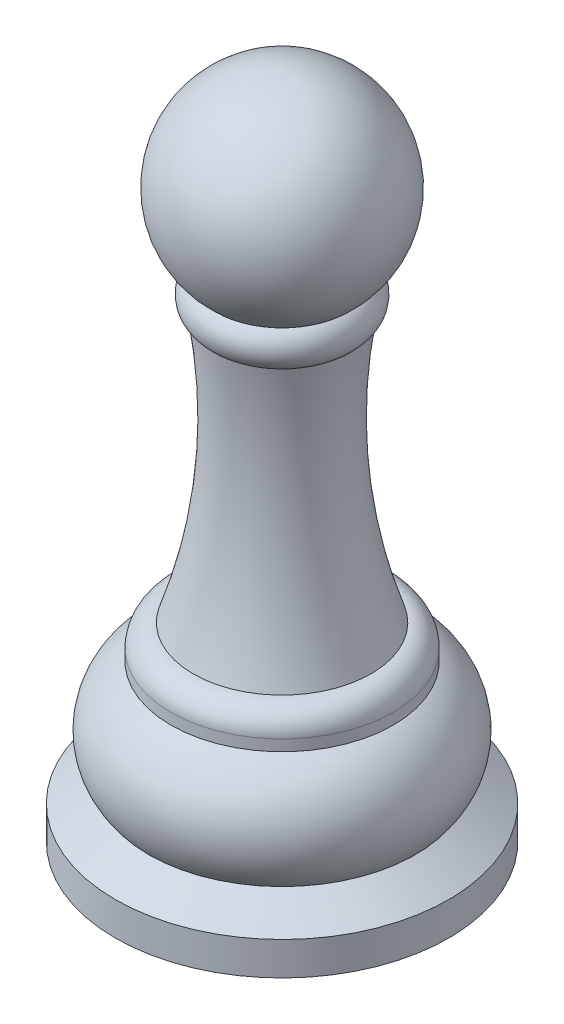
ISO-10303-21;
HEADER;
FILE_DESCRIPTION(('STEP AP214'),'2;1');
FILE_NAME('part.step','',(''),(''),'','','');
FILE_SCHEMA(('AUTOMOTIVE_DESIGN { 1 0 10303 214 1 1 1 1 }'));
ENDSEC;
DATA;
#1=APPLICATION_CONTEXT('core data for automotive mechanical design processes');
#2=APPLICATION_PROTOCOL_DEFINITION('international standard','automotive_design',2000,#1);
#3=PRODUCT_CONTEXT('',#1,'mechanical');
#4=PRODUCT('Part','Part','',(#3));
#5=PRODUCT_RELATED_PRODUCT_CATEGORY('part','',(#4));
#6=PRODUCT_DEFINITION_FORMATION('','',#4);
#7=PRODUCT_DEFINITION_CONTEXT('part definition',#1,'design');
#8=PRODUCT_DEFINITION('design','',#6,#7);
#9=PRODUCT_DEFINITION_SHAPE('','',#8);
#10=(LENGTH_UNIT() NAMED_UNIT(*) SI_UNIT(.MILLI.,.METRE.));
#11=(NAMED_UNIT(*) PLANE_ANGLE_UNIT() SI_UNIT($,.RADIAN.));
#12=(NAMED_UNIT(*) SI_UNIT($,.STERADIAN.) SOLID_ANGLE_UNIT());
#13=UNCERTAINTY_MEASURE_WITH_UNIT(LENGTH_MEASURE(1.E-05),#10,'distance_accuracy_value','');
#14=(GEOMETRIC_REPRESENTATION_CONTEXT(3) GLOBAL_UNCERTAINTY_ASSIGNED_CONTEXT((#13)) GLOBAL_UNIT_ASSIGNED_CONTEXT((#10,
#11,#12)) REPRESENTATION_CONTEXT('',''));
#15=CARTESIAN_POINT('',(0.,0.,0.));
#16=DIRECTION('',(0.,0.,1.));
#17=DIRECTION('',(1.,0.,0.));
#18=AXIS2_PLACEMENT_3D('',#15,#16,#17);
#19=CARTESIAN_POINT('',(0.,-17.3082039324994,0.));
#20=DIRECTION('',(0.,1.,0.));
#21=DIRECTION('',(0.,0.,1.));
#22=AXIS2_PLACEMENT_3D('',#19,#20,#21);
#23=TOROIDAL_SURFACE('',#22,4.8,2.);
#24=CARTESIAN_POINT('',(0.,-18.9082039324994,0.));
#25=DIRECTION('',(0.,1.,0.));
#26=DIRECTION('',(0.,0.,1.));
#27=AXIS2_PLACEMENT_3D('',#24,#25,#26);
#28=CIRCLE('',#27,5.99999999999999);
#29=CARTESIAN_POINT('',(0.,-18.9082039324994,5.99999999999999));
#30=VERTEX_POINT('',#29);
#31=EDGE_CURVE('E10',#30,#30,#28,.T.);
#32=ORIENTED_EDGE('',*,*,#31,.T.);
#33=EDGE_LOOP('',(#32));
#34=FACE_BOUND('',#33,.T.);
#35=CARTESIAN_POINT('',(0.,-15.7082039324994,0.));
#36=DIRECTION('',(0.,1.,0.));
#37=DIRECTION('',(0.,0.,1.));
#38=AXIS2_PLACEMENT_3D('',#35,#36,#37);
#39=CIRCLE('',#38,6.);
#40=CARTESIAN_POINT('',(0.,-15.7082039324994,6.));
#41=VERTEX_POINT('',#40);
#42=EDGE_CURVE('E72',#41,#41,#39,.T.);
#43=ORIENTED_EDGE('',*,*,#42,.F.);
#44=EDGE_LOOP('',(#43));
#45=FACE_BOUND('',#44,.T.);
#46=ADVANCED_FACE('F37',(#34,#45),#23,.T.);
#47=CARTESIAN_POINT('',(0.,-26.8781444651534,0.));
#48=DIRECTION('',(0.,1.,0.));
#49=DIRECTION('',(0.,0.,1.));
#50=AXIS2_PLACEMENT_3D('',#47,#48,#49);
#51=TOROIDAL_SURFACE('',#50,55.3607136081516,50.);
#52=CARTESIAN_POINT('',(0.,-42.9082039324994,0.));
#53=DIRECTION('',(0.,1.,0.));
#54=DIRECTION('',(0.,0.,1.));
#55=AXIS2_PLACEMENT_3D('',#52,#53,#54);
#56=CIRCLE('',#55,7.99999999999998);
#57=CARTESIAN_POINT('',(0.,-42.9082039324994,7.99999999999998));
#58=VERTEX_POINT('',#57);
#59=EDGE_CURVE('E44',#58,#58,#56,.T.);
#60=ORIENTED_EDGE('',*,*,#59,.T.);
#61=EDGE_LOOP('',(#60));
#62=FACE_BOUND('',#61,.T.);
#63=ORIENTED_EDGE('',*,*,#31,.F.);
#64=EDGE_LOOP('',(#63));
#65=FACE_BOUND('',#64,.T.);
#66=ADVANCED_FACE('F80',(#62,#65),#51,.F.);
#67=CARTESIAN_POINT('',(0.,-44.9082039324994,0.));
#68=DIRECTION('',(0.,1.,0.));
#69=DIRECTION('',(0.,0.,1.));
#70=AXIS2_PLACEMENT_3D('',#67,#68,#69);
#71=TOROIDAL_SURFACE('',#70,8.,1.99999999999999);
#72=CARTESIAN_POINT('',(0.,-44.9082039324994,0.));
#73=DIRECTION('',(0.,1.,0.));
#74=DIRECTION('',(0.,0.,1.));
#75=AXIS2_PLACEMENT_3D('',#72,#73,#74);
#76=CIRCLE('',#75,10.);
#77=CARTESIAN_POINT('',(0.,-44.9082039324994,10.));
#78=VERTEX_POINT('',#77);
#79=EDGE_CURVE('E49',#78,#78,#76,.T.);
#80=ORIENTED_EDGE('',*,*,#79,.T.);
#81=EDGE_LOOP('',(#80));
#82=FACE_BOUND('',#81,.T.);
#83=ORIENTED_EDGE('',*,*,#59,.F.);
#84=EDGE_LOOP('',(#83));
#85=FACE_BOUND('',#84,.T.);
#86=ADVANCED_FACE('F84',(#82,#85),#71,.T.);
#87=CARTESIAN_POINT('',(0.,67.8720714814482,0.));
#88=DIRECTION('',(0.,1.,0.));
#89=DIRECTION('',(0.,0.,1.));
#90=AXIS2_PLACEMENT_3D('',#87,#88,#89);
#91=CYLINDRICAL_SURFACE('',#90,10.);
#92=CARTESIAN_POINT('',(0.,-45.9082039324994,0.));
#93=DIRECTION('',(0.,1.,0.));
#94=DIRECTION('',(0.,0.,1.));
#95=AXIS2_PLACEMENT_3D('',#92,#93,#94);
#96=CIRCLE('',#95,10.);
#97=CARTESIAN_POINT('',(0.,-45.9082039324994,10.));
#98=VERTEX_POINT('',#97);
#99=EDGE_CURVE('E54',#98,#98,#96,.T.);
#100=ORIENTED_EDGE('',*,*,#99,.T.);
#101=EDGE_LOOP('',(#100));
#102=FACE_BOUND('',#101,.T.);
#103=ORIENTED_EDGE('',*,*,#79,.F.);
#104=EDGE_LOOP('',(#103));
#105=FACE_BOUND('',#104,.T.);
#106=ADVANCED_FACE('F88',(#102,#105),#91,.T.);
#107=CARTESIAN_POINT('',(0.,-51.2675217787139,0.));
#108=DIRECTION('',(0.,1.,0.));
#109=DIRECTION('',(0.,0.,1.));
#110=AXIS2_PLACEMENT_3D('',#107,#108,#109);
#111=TOROIDAL_SURFACE('',#110,7.30227647390511,5.99999999999998);
#112=CARTESIAN_POINT('',(0.,-55.,0.));
#113=DIRECTION('',(0.,1.,0.));
#114=DIRECTION('',(0.,0.,1.));
#115=AXIS2_PLACEMENT_3D('',#112,#113,#114);
#116=CIRCLE('',#115,12.);
#117=CARTESIAN_POINT('',(0.,-55.,12.));
#118=VERTEX_POINT('',#117);
#119=EDGE_CURVE('E60',#118,#118,#116,.T.);
#120=ORIENTED_EDGE('',*,*,#119,.T.);
#121=EDGE_LOOP('',(#120));
#122=FACE_BOUND('',#121,.T.);
#123=ORIENTED_EDGE('',*,*,#99,.F.);
#124=EDGE_LOOP('',(#123));
#125=FACE_BOUND('',#124,.T.);
#126=ADVANCED_FACE('F95',(#122,#125),#111,.T.);
#127=CARTESIAN_POINT('',(0.,-55.,0.));
#128=DIRECTION('',(0.,-1.,0.));
#129=DIRECTION('',(0.,0.,-1.));
#130=AXIS2_PLACEMENT_3D('',#127,#128,#129);
#131=CONICAL_SURFACE('',#130,12.,0.982793723247328);
#132=CARTESIAN_POINT('',(0.,-57.,0.));
#133=DIRECTION('',(0.,1.,0.));
#134=DIRECTION('',(0.,0.,1.));
#135=AXIS2_PLACEMENT_3D('',#132,#133,#134);
#136=CIRCLE('',#135,15.);
#137=CARTESIAN_POINT('',(0.,-57.,15.));
#138=VERTEX_POINT('',#137);
#139=EDGE_CURVE('E64',#138,#138,#136,.T.);
#140=ORIENTED_EDGE('',*,*,#139,.T.);
#141=EDGE_LOOP('',(#140));
#142=FACE_BOUND('',#141,.T.);
#143=ORIENTED_EDGE('',*,*,#119,.F.);
#144=EDGE_LOOP('',(#143));
#145=FACE_BOUND('',#144,.T.);
#146=ADVANCED_FACE('F99',(#142,#145),#131,.T.);
#147=CARTESIAN_POINT('',(0.,67.8720714814482,0.));
#148=DIRECTION('',(0.,1.,0.));
#149=DIRECTION('',(0.,0.,1.));
#150=AXIS2_PLACEMENT_3D('',#147,#148,#149);
#151=CYLINDRICAL_SURFACE('',#150,15.);
#152=CARTESIAN_POINT('',(0.,-60.,0.));
#153=DIRECTION('',(0.,1.,0.));
#154=DIRECTION('',(0.,0.,1.));
#155=AXIS2_PLACEMENT_3D('',#152,#153,#154);
#156=CIRCLE('',#155,15.);
#157=CARTESIAN_POINT('',(0.,-60.,15.));
#158=VERTEX_POINT('',#157);
#159=EDGE_CURVE('E68',#158,#158,#156,.T.);
#160=ORIENTED_EDGE('',*,*,#159,.T.);
#161=EDGE_LOOP('',(#160));
#162=FACE_BOUND('',#161,.T.);
#163=ORIENTED_EDGE('',*,*,#139,.F.);
#164=EDGE_LOOP('',(#163));
#165=FACE_BOUND('',#164,.T.);
#166=ADVANCED_FACE('F103',(#162,#165),#151,.T.);
#167=CARTESIAN_POINT('',(-15.,-60.,0.));
#168=DIRECTION('',(0.,-1.,0.));
#169=DIRECTION('',(0.,0.,-1.));
#170=AXIS2_PLACEMENT_3D('',#167,#168,#169);
#171=PLANE('',#170);
#172=ORIENTED_EDGE('',*,*,#159,.F.);
#173=EDGE_LOOP('',(#172));
#174=FACE_BOUND('',#173,.T.);
#175=ADVANCED_FACE('F107',(#174),#171,.T.);
#176=CARTESIAN_POINT('',(0.,-9.,0.));
#177=DIRECTION('',(0.,1.,0.));
#178=DIRECTION('',(1.,0.,0.));
#179=AXIS2_PLACEMENT_3D('',#176,#177,#178);
#180=SPHERICAL_SURFACE('',#179,9.);
#181=ORIENTED_EDGE('',*,*,#42,.T.);
#182=EDGE_LOOP('',(#181));
#183=FACE_BOUND('',#182,.T.);
#184=ADVANCED_FACE('F77',(#183),#180,.T.);
#185=CLOSED_SHELL('',(#46,#66,#86,#106,#126,#146,#166,#175,#184));
#186=MANIFOLD_SOLID_BREP('B2',#185);
#187=ADVANCED_BREP_SHAPE_REPRESENTATION('',(#18,#186),#14);
#188=SHAPE_DEFINITION_REPRESENTATION(#9,#187);
ENDSEC;
END-ISO-10303-21;
